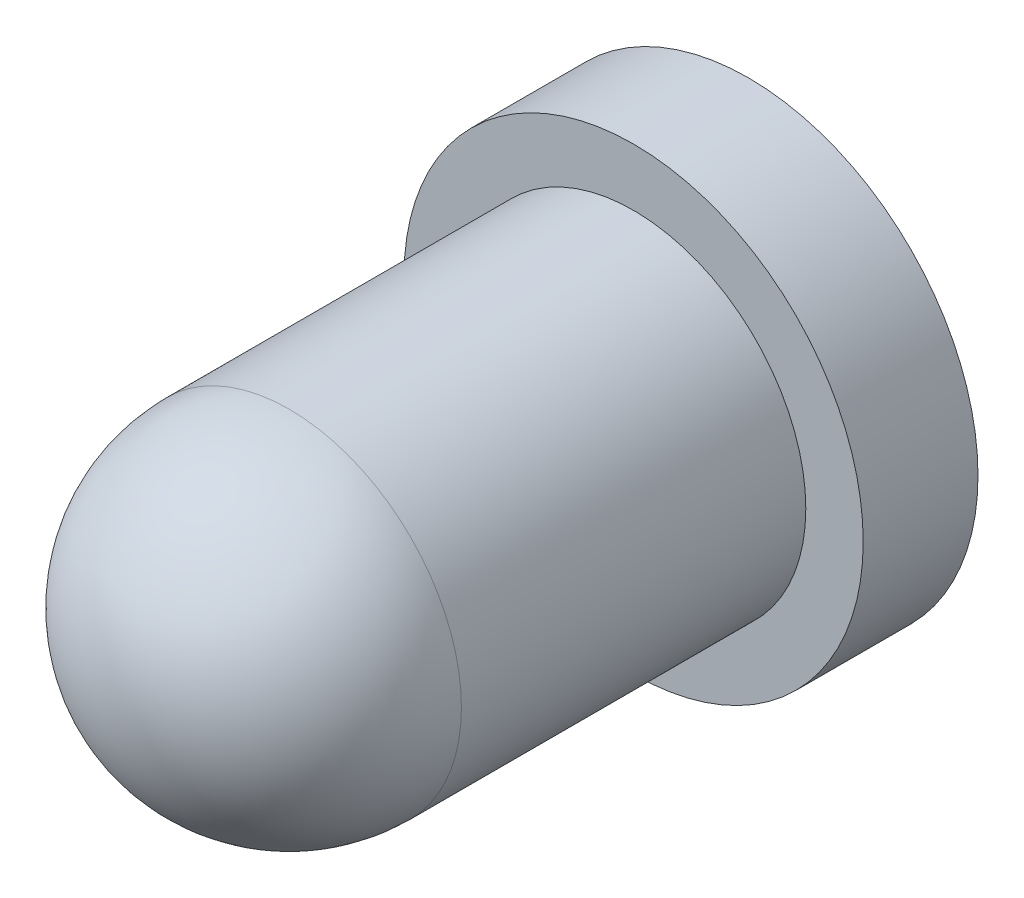
ISO-10303-21;
HEADER;
FILE_DESCRIPTION(('STEP AP214'),'2;1');
FILE_NAME('part.step','',(''),(''),'','','');
FILE_SCHEMA(('AUTOMOTIVE_DESIGN { 1 0 10303 214 1 1 1 1 }'));
ENDSEC;
DATA;
#1=APPLICATION_CONTEXT('core data for automotive mechanical design processes');
#2=APPLICATION_PROTOCOL_DEFINITION('international standard','automotive_design',2000,#1);
#3=PRODUCT_CONTEXT('',#1,'mechanical');
#4=PRODUCT('Part','Part','',(#3));
#5=PRODUCT_RELATED_PRODUCT_CATEGORY('part','',(#4));
#6=PRODUCT_DEFINITION_FORMATION('','',#4);
#7=PRODUCT_DEFINITION_CONTEXT('part definition',#1,'design');
#8=PRODUCT_DEFINITION('design','',#6,#7);
#9=PRODUCT_DEFINITION_SHAPE('','',#8);
#10=(LENGTH_UNIT() NAMED_UNIT(*) SI_UNIT(.MILLI.,.METRE.));
#11=(NAMED_UNIT(*) PLANE_ANGLE_UNIT() SI_UNIT($,.RADIAN.));
#12=(NAMED_UNIT(*) SI_UNIT($,.STERADIAN.) SOLID_ANGLE_UNIT());
#13=UNCERTAINTY_MEASURE_WITH_UNIT(LENGTH_MEASURE(1.E-05),#10,'distance_accuracy_value','');
#14=(GEOMETRIC_REPRESENTATION_CONTEXT(3) GLOBAL_UNCERTAINTY_ASSIGNED_CONTEXT((#13)) GLOBAL_UNIT_ASSIGNED_CONTEXT((#10,
#11,#12)) REPRESENTATION_CONTEXT('',''));
#15=CARTESIAN_POINT('',(0.,0.,0.));
#16=DIRECTION('',(0.,0.,1.));
#17=DIRECTION('',(1.,0.,0.));
#18=AXIS2_PLACEMENT_3D('',#15,#16,#17);
#19=CARTESIAN_POINT('',(0.,0.,0.));
#20=DIRECTION('',(0.,0.,1.));
#21=DIRECTION('',(1.,0.,0.));
#22=AXIS2_PLACEMENT_3D('',#19,#20,#21);
#23=PLANE('',#22);
#24=CARTESIAN_POINT('',(0.,0.,0.));
#25=DIRECTION('',(0.,0.,-1.));
#26=DIRECTION('',(-1.,0.,0.));
#27=AXIS2_PLACEMENT_3D('',#24,#25,#26);
#28=CIRCLE('',#27,2.);
#29=CARTESIAN_POINT('',(-2.,0.,0.));
#30=VERTEX_POINT('',#29);
#31=EDGE_CURVE('E20',#30,#30,#28,.F.);
#32=ORIENTED_EDGE('',*,*,#31,.F.);
#33=EDGE_LOOP('',(#32));
#34=FACE_BOUND('',#33,.T.);
#35=ADVANCED_FACE('F17',(#34),#23,.F.);
#36=CARTESIAN_POINT('',(0.,0.,0.));
#37=DIRECTION('',(0.,0.,-1.));
#38=DIRECTION('',(-1.,0.,0.));
#39=AXIS2_PLACEMENT_3D('',#36,#37,#38);
#40=CYLINDRICAL_SURFACE('',#39,2.);
#41=ORIENTED_EDGE('',*,*,#31,.T.);
#42=EDGE_LOOP('',(#41));
#43=FACE_BOUND('',#42,.T.);
#44=CARTESIAN_POINT('',(0.,0.,1.));
#45=DIRECTION('',(0.,0.,-1.));
#46=DIRECTION('',(-1.,0.,0.));
#47=AXIS2_PLACEMENT_3D('',#44,#45,#46);
#48=CIRCLE('',#47,2.);
#49=CARTESIAN_POINT('',(-2.,0.,1.));
#50=VERTEX_POINT('',#49);
#51=EDGE_CURVE('E36',#50,#50,#48,.T.);
#52=ORIENTED_EDGE('',*,*,#51,.T.);
#53=EDGE_LOOP('',(#52));
#54=FACE_BOUND('',#53,.T.);
#55=ADVANCED_FACE('F48',(#43,#54),#40,.T.);
#56=CARTESIAN_POINT('',(0.,0.,1.));
#57=DIRECTION('',(0.,0.,-1.));
#58=DIRECTION('',(-1.,0.,0.));
#59=AXIS2_PLACEMENT_3D('',#56,#57,#58);
#60=PLANE('',#59);
#61=CARTESIAN_POINT('',(0.,0.,1.));
#62=DIRECTION('',(0.,0.,1.));
#63=DIRECTION('',(1.,0.,0.));
#64=AXIS2_PLACEMENT_3D('',#61,#62,#63);
#65=CIRCLE('',#64,1.5);
#66=CARTESIAN_POINT('',(1.5,0.,1.));
#67=VERTEX_POINT('',#66);
#68=EDGE_CURVE('E25',#67,#67,#65,.T.);
#69=ORIENTED_EDGE('',*,*,#68,.F.);
#70=EDGE_LOOP('',(#69));
#71=FACE_BOUND('',#70,.T.);
#72=ORIENTED_EDGE('',*,*,#51,.F.);
#73=EDGE_LOOP('',(#72));
#74=FACE_BOUND('',#73,.T.);
#75=ADVANCED_FACE('F40',(#71,#74),#60,.F.);
#76=CARTESIAN_POINT('',(0.,0.,4.));
#77=DIRECTION('',(-7.14304278073908E-13,-1.,0.));
#78=DIRECTION('',(1.,-7.14304278073908E-13,0.));
#79=AXIS2_PLACEMENT_3D('',#76,#77,#78);
#80=SPHERICAL_SURFACE('',#79,1.5);
#81=CARTESIAN_POINT('',(0.,0.,4.));
#82=DIRECTION('',(0.,0.,1.));
#83=DIRECTION('',(1.,0.,0.));
#84=AXIS2_PLACEMENT_3D('',#81,#82,#83);
#85=CIRCLE('',#84,1.5);
#86=CARTESIAN_POINT('',(1.07123502266829E-12,1.5,4.));
#87=VERTEX_POINT('',#86);
#88=CARTESIAN_POINT('',(-1.07141871968816E-12,-1.5,4.));
#89=VERTEX_POINT('',#88);
#90=EDGE_CURVE('E11',#87,#89,#85,.F.);
#91=ORIENTED_EDGE('',*,*,#90,.F.);
#92=CARTESIAN_POINT('',(0.,0.,4.));
#93=DIRECTION('',(0.,0.,1.));
#94=DIRECTION('',(1.,0.,0.));
#95=AXIS2_PLACEMENT_3D('',#92,#93,#94);
#96=CIRCLE('',#95,1.5);
#97=EDGE_CURVE('E32',#89,#87,#96,.F.);
#98=ORIENTED_EDGE('',*,*,#97,.F.);
#99=EDGE_LOOP('',(#91,#98));
#100=FACE_BOUND('',#99,.T.);
#101=ADVANCED_FACE('F38',(#100),#80,.T.);
#102=CARTESIAN_POINT('',(0.,0.,0.));
#103=DIRECTION('',(0.,0.,1.));
#104=DIRECTION('',(1.,0.,0.));
#105=AXIS2_PLACEMENT_3D('',#102,#103,#104);
#106=CYLINDRICAL_SURFACE('',#105,1.5);
#107=ORIENTED_EDGE('',*,*,#97,.T.);
#108=ORIENTED_EDGE('',*,*,#90,.T.);
#109=EDGE_LOOP('',(#107,#108));
#110=FACE_BOUND('',#109,.T.);
#111=ORIENTED_EDGE('',*,*,#68,.T.);
#112=EDGE_LOOP('',(#111));
#113=FACE_BOUND('',#112,.T.);
#114=ADVANCED_FACE('F33',(#110,#113),#106,.T.);
#115=CLOSED_SHELL('',(#35,#55,#75,#101,#114));
#116=MANIFOLD_SOLID_BREP('B1',#115);
#117=ADVANCED_BREP_SHAPE_REPRESENTATION('',(#18,#116),#14);
#118=SHAPE_DEFINITION_REPRESENTATION(#9,#117);
ENDSEC;
END-ISO-10303-21;
